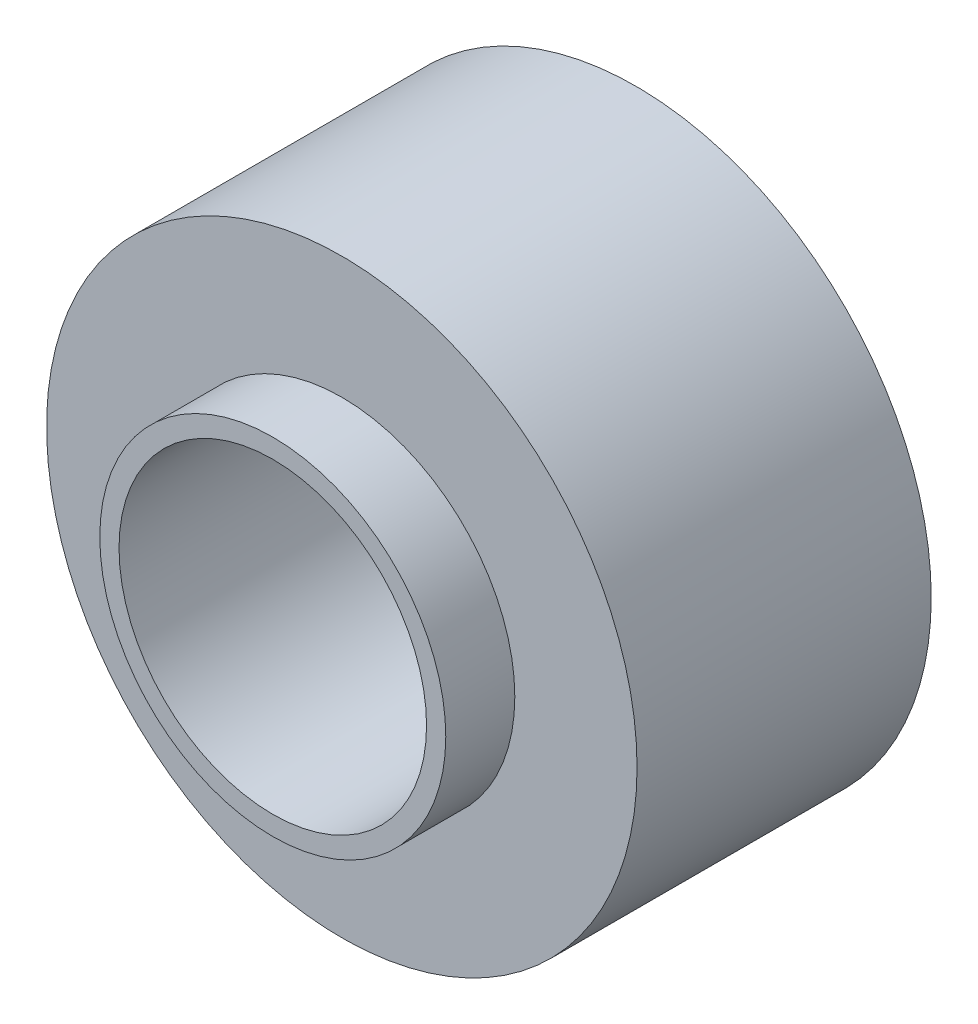
ISO-10303-21;
HEADER;
FILE_DESCRIPTION(('STEP AP214'),'2;1');
FILE_NAME('part.step','',(''),(''),'','','');
FILE_SCHEMA(('AUTOMOTIVE_DESIGN { 1 0 10303 214 1 1 1 1 }'));
ENDSEC;
DATA;
#1=APPLICATION_CONTEXT('core data for automotive mechanical design processes');
#2=APPLICATION_PROTOCOL_DEFINITION('international standard','automotive_design',2000,#1);
#3=PRODUCT_CONTEXT('',#1,'mechanical');
#4=PRODUCT('Part','Part','',(#3));
#5=PRODUCT_RELATED_PRODUCT_CATEGORY('part','',(#4));
#6=PRODUCT_DEFINITION_FORMATION('','',#4);
#7=PRODUCT_DEFINITION_CONTEXT('part definition',#1,'design');
#8=PRODUCT_DEFINITION('design','',#6,#7);
#9=PRODUCT_DEFINITION_SHAPE('','',#8);
#10=(LENGTH_UNIT() NAMED_UNIT(*) SI_UNIT(.MILLI.,.METRE.));
#11=(NAMED_UNIT(*) PLANE_ANGLE_UNIT() SI_UNIT($,.RADIAN.));
#12=(NAMED_UNIT(*) SI_UNIT($,.STERADIAN.) SOLID_ANGLE_UNIT());
#13=UNCERTAINTY_MEASURE_WITH_UNIT(LENGTH_MEASURE(1.E-05),#10,'distance_accuracy_value','');
#14=(GEOMETRIC_REPRESENTATION_CONTEXT(3) GLOBAL_UNCERTAINTY_ASSIGNED_CONTEXT((#13)) GLOBAL_UNIT_ASSIGNED_CONTEXT((#10,
#11,#12)) REPRESENTATION_CONTEXT('',''));
#15=CARTESIAN_POINT('',(0.,0.,0.));
#16=DIRECTION('',(0.,0.,1.));
#17=DIRECTION('',(1.,0.,0.));
#18=AXIS2_PLACEMENT_3D('',#15,#16,#17);
#19=CARTESIAN_POINT('',(0.,0.,35.6997));
#20=DIRECTION('',(0.,0.,-1.));
#21=DIRECTION('',(-1.,0.,0.));
#22=AXIS2_PLACEMENT_3D('',#19,#20,#21);
#23=CYLINDRICAL_SURFACE('',#22,28.575);
#24=CARTESIAN_POINT('',(0.,0.,-35.6997));
#25=DIRECTION('',(0.,0.,1.));
#26=DIRECTION('',(1.,0.,0.));
#27=AXIS2_PLACEMENT_3D('',#24,#25,#26);
#28=CIRCLE('',#27,28.575);
#29=CARTESIAN_POINT('',(28.575,0.,-35.6997));
#30=VERTEX_POINT('',#29);
#31=EDGE_CURVE('E41',#30,#30,#28,.T.);
#32=ORIENTED_EDGE('',*,*,#31,.T.);
#33=EDGE_LOOP('',(#32));
#34=FACE_BOUND('',#33,.T.);
#35=CARTESIAN_POINT('',(0.,0.,-24.2951));
#36=DIRECTION('',(0.,0.,1.));
#37=DIRECTION('',(1.,0.,0.));
#38=AXIS2_PLACEMENT_3D('',#35,#36,#37);
#39=CIRCLE('',#38,28.575);
#40=CARTESIAN_POINT('',(28.575,0.,-24.2951));
#41=VERTEX_POINT('',#40);
#42=EDGE_CURVE('E10',#41,#41,#39,.T.);
#43=ORIENTED_EDGE('',*,*,#42,.F.);
#44=EDGE_LOOP('',(#43));
#45=FACE_BOUND('',#44,.T.);
#46=ADVANCED_FACE('F30',(#34,#45),#23,.T.);
#47=CARTESIAN_POINT('',(0.,0.,35.6997));
#48=DIRECTION('',(0.,0.,1.));
#49=DIRECTION('',(1.,0.,0.));
#50=AXIS2_PLACEMENT_3D('',#47,#48,#49);
#51=PLANE('',#50);
#52=CARTESIAN_POINT('',(0.,0.,35.6997));
#53=DIRECTION('',(0.,0.,1.));
#54=DIRECTION('',(1.,0.,0.));
#55=AXIS2_PLACEMENT_3D('',#52,#53,#54);
#56=CIRCLE('',#55,28.575);
#57=CARTESIAN_POINT('',(28.575,0.,35.6997));
#58=VERTEX_POINT('',#57);
#59=EDGE_CURVE('E37',#58,#58,#56,.T.);
#60=ORIENTED_EDGE('',*,*,#59,.T.);
#61=EDGE_LOOP('',(#60));
#62=FACE_BOUND('',#61,.T.);
#63=CARTESIAN_POINT('',(0.,0.,35.6997));
#64=DIRECTION('',(0.,0.,1.));
#65=DIRECTION('',(1.,0.,0.));
#66=AXIS2_PLACEMENT_3D('',#63,#64,#65);
#67=CIRCLE('',#66,25.4);
#68=CARTESIAN_POINT('',(25.4,0.,35.6997));
#69=VERTEX_POINT('',#68);
#70=EDGE_CURVE('E46',#69,#69,#67,.T.);
#71=ORIENTED_EDGE('',*,*,#70,.F.);
#72=EDGE_LOOP('',(#71));
#73=FACE_BOUND('',#72,.T.);
#74=ADVANCED_FACE('F81',(#62,#73),#51,.T.);
#75=CARTESIAN_POINT('',(0.,0.,-35.6997));
#76=DIRECTION('',(0.,0.,1.));
#77=DIRECTION('',(1.,0.,0.));
#78=AXIS2_PLACEMENT_3D('',#75,#76,#77);
#79=PLANE('',#78);
#80=ORIENTED_EDGE('',*,*,#31,.F.);
#81=EDGE_LOOP('',(#80));
#82=FACE_BOUND('',#81,.T.);
#83=CARTESIAN_POINT('',(0.,0.,-35.6997));
#84=DIRECTION('',(0.,0.,1.));
#85=DIRECTION('',(1.,0.,0.));
#86=AXIS2_PLACEMENT_3D('',#83,#84,#85);
#87=CIRCLE('',#86,25.4);
#88=CARTESIAN_POINT('',(25.4,0.,-35.6997));
#89=VERTEX_POINT('',#88);
#90=EDGE_CURVE('E48',#89,#89,#87,.T.);
#91=ORIENTED_EDGE('',*,*,#90,.T.);
#92=EDGE_LOOP('',(#91));
#93=FACE_BOUND('',#92,.T.);
#94=ADVANCED_FACE('F86',(#82,#93),#79,.F.);
#95=CARTESIAN_POINT('',(0.,0.,24.2951));
#96=DIRECTION('',(0.,0.,1.));
#97=DIRECTION('',(1.,0.,0.));
#98=AXIS2_PLACEMENT_3D('',#95,#96,#97);
#99=CIRCLE('',#98,28.575);
#100=CARTESIAN_POINT('',(28.575,0.,24.2951));
#101=VERTEX_POINT('',#100);
#102=EDGE_CURVE('E57',#101,#101,#99,.T.);
#103=ORIENTED_EDGE('',*,*,#102,.T.);
#104=EDGE_LOOP('',(#103));
#105=FACE_BOUND('',#104,.T.);
#106=ORIENTED_EDGE('',*,*,#59,.F.);
#107=EDGE_LOOP('',(#106));
#108=FACE_BOUND('',#107,.T.);
#109=ADVANCED_FACE('F32',(#105,#108),#23,.T.);
#110=CARTESIAN_POINT('',(0.,0.,35.6997));
#111=DIRECTION('',(0.,0.,-1.));
#112=DIRECTION('',(-1.,0.,0.));
#113=AXIS2_PLACEMENT_3D('',#110,#111,#112);
#114=CYLINDRICAL_SURFACE('',#113,25.4);
#115=ORIENTED_EDGE('',*,*,#70,.T.);
#116=EDGE_LOOP('',(#115));
#117=FACE_BOUND('',#116,.T.);
#118=ORIENTED_EDGE('',*,*,#90,.F.);
#119=EDGE_LOOP('',(#118));
#120=FACE_BOUND('',#119,.T.);
#121=ADVANCED_FACE('F68',(#117,#120),#114,.F.);
#122=CARTESIAN_POINT('',(0.,0.,24.2951));
#123=DIRECTION('',(0.,0.,1.));
#124=DIRECTION('',(1.,0.,0.));
#125=AXIS2_PLACEMENT_3D('',#122,#123,#124);
#126=PLANE('',#125);
#127=CARTESIAN_POINT('',(0.,0.,24.2951));
#128=DIRECTION('',(0.,0.,1.));
#129=DIRECTION('',(1.,0.,0.));
#130=AXIS2_PLACEMENT_3D('',#127,#128,#129);
#131=CIRCLE('',#130,48.768);
#132=CARTESIAN_POINT('',(48.768,0.,24.2951));
#133=VERTEX_POINT('',#132);
#134=EDGE_CURVE('E51',#133,#133,#131,.T.);
#135=ORIENTED_EDGE('',*,*,#134,.T.);
#136=EDGE_LOOP('',(#135));
#137=FACE_BOUND('',#136,.T.);
#138=ORIENTED_EDGE('',*,*,#102,.F.);
#139=EDGE_LOOP('',(#138));
#140=FACE_BOUND('',#139,.T.);
#141=ADVANCED_FACE('F65',(#137,#140),#126,.T.);
#142=CARTESIAN_POINT('',(0.,0.,-24.2951));
#143=DIRECTION('',(0.,0.,1.));
#144=DIRECTION('',(1.,0.,0.));
#145=AXIS2_PLACEMENT_3D('',#142,#143,#144);
#146=PLANE('',#145);
#147=CARTESIAN_POINT('',(0.,0.,-24.2951));
#148=DIRECTION('',(0.,0.,1.));
#149=DIRECTION('',(1.,0.,0.));
#150=AXIS2_PLACEMENT_3D('',#147,#148,#149);
#151=CIRCLE('',#150,48.768);
#152=CARTESIAN_POINT('',(48.768,0.,-24.2951));
#153=VERTEX_POINT('',#152);
#154=EDGE_CURVE('E54',#153,#153,#151,.T.);
#155=ORIENTED_EDGE('',*,*,#154,.F.);
#156=EDGE_LOOP('',(#155));
#157=FACE_BOUND('',#156,.T.);
#158=ORIENTED_EDGE('',*,*,#42,.T.);
#159=EDGE_LOOP('',(#158));
#160=FACE_BOUND('',#159,.T.);
#161=ADVANCED_FACE('F67',(#157,#160),#146,.F.);
#162=CARTESIAN_POINT('',(0.,0.,24.2951));
#163=DIRECTION('',(0.,0.,-1.));
#164=DIRECTION('',(-1.,0.,0.));
#165=AXIS2_PLACEMENT_3D('',#162,#163,#164);
#166=CYLINDRICAL_SURFACE('',#165,48.768);
#167=ORIENTED_EDGE('',*,*,#134,.F.);
#168=EDGE_LOOP('',(#167));
#169=FACE_BOUND('',#168,.T.);
#170=ORIENTED_EDGE('',*,*,#154,.T.);
#171=EDGE_LOOP('',(#170));
#172=FACE_BOUND('',#171,.T.);
#173=ADVANCED_FACE('F75',(#169,#172),#166,.T.);
#174=CLOSED_SHELL('',(#46,#74,#94,#109,#121,#141,#161,#173));
#175=MANIFOLD_SOLID_BREP('B2',#174);
#176=ADVANCED_BREP_SHAPE_REPRESENTATION('',(#18,#175),#14);
#177=SHAPE_DEFINITION_REPRESENTATION(#9,#176);
ENDSEC;
END-ISO-10303-21;
